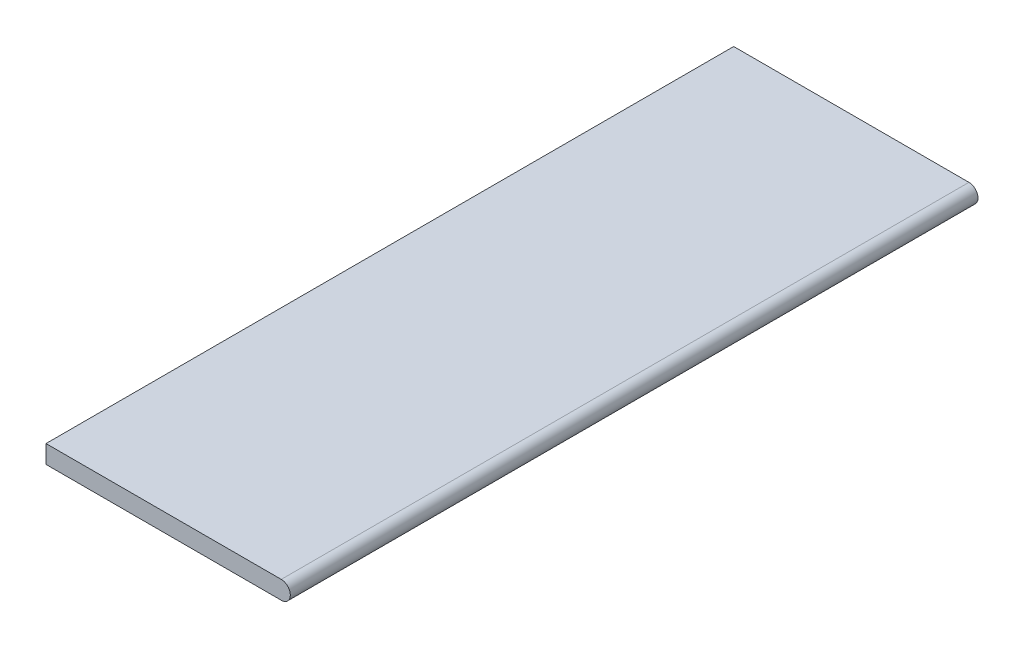
ISO-10303-21;
HEADER;
FILE_DESCRIPTION(('STEP AP214'),'2;1');
FILE_NAME('part.step','',(''),(''),'','','');
FILE_SCHEMA(('AUTOMOTIVE_DESIGN { 1 0 10303 214 1 1 1 1 }'));
ENDSEC;
DATA;
#1=APPLICATION_CONTEXT('core data for automotive mechanical design processes');
#2=APPLICATION_PROTOCOL_DEFINITION('international standard','automotive_design',2000,#1);
#3=PRODUCT_CONTEXT('',#1,'mechanical');
#4=PRODUCT('Part','Part','',(#3));
#5=PRODUCT_RELATED_PRODUCT_CATEGORY('part','',(#4));
#6=PRODUCT_DEFINITION_FORMATION('','',#4);
#7=PRODUCT_DEFINITION_CONTEXT('part definition',#1,'design');
#8=PRODUCT_DEFINITION('design','',#6,#7);
#9=PRODUCT_DEFINITION_SHAPE('','',#8);
#10=(LENGTH_UNIT() NAMED_UNIT(*) SI_UNIT(.MILLI.,.METRE.));
#11=(NAMED_UNIT(*) PLANE_ANGLE_UNIT() SI_UNIT($,.RADIAN.));
#12=(NAMED_UNIT(*) SI_UNIT($,.STERADIAN.) SOLID_ANGLE_UNIT());
#13=UNCERTAINTY_MEASURE_WITH_UNIT(LENGTH_MEASURE(1.E-05),#10,'distance_accuracy_value','');
#14=(GEOMETRIC_REPRESENTATION_CONTEXT(3) GLOBAL_UNCERTAINTY_ASSIGNED_CONTEXT((#13)) GLOBAL_UNIT_ASSIGNED_CONTEXT((#10,
#11,#12)) REPRESENTATION_CONTEXT('',''));
#15=CARTESIAN_POINT('',(0.,0.,0.));
#16=DIRECTION('',(0.,0.,1.));
#17=DIRECTION('',(1.,0.,0.));
#18=AXIS2_PLACEMENT_3D('',#15,#16,#17);
#19=CARTESIAN_POINT('',(-32.5,5.,-95.));
#20=DIRECTION('',(0.,0.,1.));
#21=DIRECTION('',(1.,0.,0.));
#22=AXIS2_PLACEMENT_3D('',#19,#20,#21);
#23=PLANE('',#22);
#24=DIRECTION('',(-1.,0.,0.));
#25=VECTOR('',#24,1.);
#26=CARTESIAN_POINT('',(-32.5,0.,-95.));
#27=LINE('',#26,#25);
#28=CARTESIAN_POINT('',(32.5,0.,-95.));
#29=VERTEX_POINT('',#28);
#30=CARTESIAN_POINT('',(-32.5,0.,-95.));
#31=VERTEX_POINT('',#30);
#32=EDGE_CURVE('E95',#29,#31,#27,.T.);
#33=ORIENTED_EDGE('',*,*,#32,.T.);
#34=DIRECTION('',(0.,-1.,0.));
#35=VECTOR('',#34,1.);
#36=CARTESIAN_POINT('',(-32.5,5.,-95.));
#37=LINE('',#36,#35);
#38=CARTESIAN_POINT('',(-32.5,5.,-95.));
#39=VERTEX_POINT('',#38);
#40=EDGE_CURVE('E11',#39,#31,#37,.T.);
#41=ORIENTED_EDGE('',*,*,#40,.F.);
#42=DIRECTION('',(-1.,0.,0.));
#43=VECTOR('',#42,1.);
#44=CARTESIAN_POINT('',(-32.5,5.,-95.));
#45=LINE('',#44,#43);
#46=CARTESIAN_POINT('',(32.5,5.,-95.));
#47=VERTEX_POINT('',#46);
#48=EDGE_CURVE('E91',#47,#39,#45,.T.);
#49=ORIENTED_EDGE('',*,*,#48,.F.);
#50=CARTESIAN_POINT('',(32.5,2.5,-95.));
#51=DIRECTION('',(0.,0.,1.));
#52=DIRECTION('',(1.,0.,0.));
#53=AXIS2_PLACEMENT_3D('',#50,#51,#52);
#54=CIRCLE('',#53,2.5);
#55=EDGE_CURVE('E105',#47,#29,#54,.F.);
#56=ORIENTED_EDGE('',*,*,#55,.T.);
#57=EDGE_LOOP('',(#33,#41,#49,#56));
#58=FACE_BOUND('',#57,.T.);
#59=ADVANCED_FACE('F45',(#58),#23,.F.);
#60=CARTESIAN_POINT('',(-32.5,5.,-95.));
#61=DIRECTION('',(1.,0.,0.));
#62=DIRECTION('',(0.,0.,-1.));
#63=AXIS2_PLACEMENT_3D('',#60,#61,#62);
#64=PLANE('',#63);
#65=DIRECTION('',(0.,0.,1.));
#66=VECTOR('',#65,1.);
#67=CARTESIAN_POINT('',(-32.5,0.,-95.));
#68=LINE('',#67,#66);
#69=CARTESIAN_POINT('',(-32.5,0.,95.));
#70=VERTEX_POINT('',#69);
#71=EDGE_CURVE('E76',#31,#70,#68,.T.);
#72=ORIENTED_EDGE('',*,*,#71,.T.);
#73=DIRECTION('',(0.,-1.,0.));
#74=VECTOR('',#73,1.);
#75=CARTESIAN_POINT('',(-32.5,5.,95.));
#76=LINE('',#75,#74);
#77=CARTESIAN_POINT('',(-32.5,5.,95.));
#78=VERTEX_POINT('',#77);
#79=EDGE_CURVE('E54',#78,#70,#76,.T.);
#80=ORIENTED_EDGE('',*,*,#79,.F.);
#81=DIRECTION('',(0.,0.,1.));
#82=VECTOR('',#81,1.);
#83=CARTESIAN_POINT('',(-32.5,5.,-95.));
#84=LINE('',#83,#82);
#85=EDGE_CURVE('E119',#39,#78,#84,.T.);
#86=ORIENTED_EDGE('',*,*,#85,.F.);
#87=ORIENTED_EDGE('',*,*,#40,.T.);
#88=EDGE_LOOP('',(#72,#80,#86,#87));
#89=FACE_BOUND('',#88,.T.);
#90=ADVANCED_FACE('F130',(#89),#64,.F.);
#91=CARTESIAN_POINT('',(-32.5,5.,95.));
#92=DIRECTION('',(0.,0.,-1.));
#93=DIRECTION('',(-1.,0.,0.));
#94=AXIS2_PLACEMENT_3D('',#91,#92,#93);
#95=PLANE('',#94);
#96=DIRECTION('',(1.,0.,0.));
#97=VECTOR('',#96,1.);
#98=CARTESIAN_POINT('',(-32.5,0.,95.));
#99=LINE('',#98,#97);
#100=CARTESIAN_POINT('',(32.5,0.,95.));
#101=VERTEX_POINT('',#100);
#102=EDGE_CURVE('E83',#70,#101,#99,.T.);
#103=ORIENTED_EDGE('',*,*,#102,.T.);
#104=CARTESIAN_POINT('',(32.5,2.5,95.));
#105=DIRECTION('',(0.,0.,1.));
#106=DIRECTION('',(1.,0.,0.));
#107=AXIS2_PLACEMENT_3D('',#104,#105,#106);
#108=CIRCLE('',#107,2.5);
#109=CARTESIAN_POINT('',(32.5,5.,95.));
#110=VERTEX_POINT('',#109);
#111=EDGE_CURVE('E106',#110,#101,#108,.F.);
#112=ORIENTED_EDGE('',*,*,#111,.F.);
#113=DIRECTION('',(1.,0.,0.));
#114=VECTOR('',#113,1.);
#115=CARTESIAN_POINT('',(-32.5,5.,95.));
#116=LINE('',#115,#114);
#117=EDGE_CURVE('E62',#78,#110,#116,.T.);
#118=ORIENTED_EDGE('',*,*,#117,.F.);
#119=ORIENTED_EDGE('',*,*,#79,.T.);
#120=EDGE_LOOP('',(#103,#112,#118,#119));
#121=FACE_BOUND('',#120,.T.);
#122=ADVANCED_FACE('F128',(#121),#95,.F.);
#123=CARTESIAN_POINT('',(0.,5.,0.));
#124=DIRECTION('',(0.,1.,0.));
#125=DIRECTION('',(0.,0.,1.));
#126=AXIS2_PLACEMENT_3D('',#123,#124,#125);
#127=PLANE('',#126);
#128=DIRECTION('',(0.,0.,-1.));
#129=VECTOR('',#128,1.);
#130=CARTESIAN_POINT('',(32.5,5.,-95.));
#131=LINE('',#130,#129);
#132=EDGE_CURVE('E114',#110,#47,#131,.T.);
#133=ORIENTED_EDGE('',*,*,#132,.T.);
#134=ORIENTED_EDGE('',*,*,#48,.T.);
#135=ORIENTED_EDGE('',*,*,#85,.T.);
#136=ORIENTED_EDGE('',*,*,#117,.T.);
#137=EDGE_LOOP('',(#133,#134,#135,#136));
#138=FACE_BOUND('',#137,.T.);
#139=ADVANCED_FACE('F131',(#138),#127,.T.);
#140=CARTESIAN_POINT('',(0.,0.,0.));
#141=DIRECTION('',(0.,1.,0.));
#142=DIRECTION('',(0.,0.,1.));
#143=AXIS2_PLACEMENT_3D('',#140,#141,#142);
#144=PLANE('',#143);
#145=DIRECTION('',(0.,0.,-1.));
#146=VECTOR('',#145,1.);
#147=CARTESIAN_POINT('',(32.5,0.,-95.));
#148=LINE('',#147,#146);
#149=EDGE_CURVE('E98',#101,#29,#148,.T.);
#150=ORIENTED_EDGE('',*,*,#149,.F.);
#151=ORIENTED_EDGE('',*,*,#102,.F.);
#152=ORIENTED_EDGE('',*,*,#71,.F.);
#153=ORIENTED_EDGE('',*,*,#32,.F.);
#154=EDGE_LOOP('',(#150,#151,#152,#153));
#155=FACE_BOUND('',#154,.T.);
#156=ADVANCED_FACE('F97',(#155),#144,.F.);
#157=CARTESIAN_POINT('',(32.5,2.5,95.));
#158=DIRECTION('',(0.,0.,-1.));
#159=DIRECTION('',(-1.,0.,0.));
#160=AXIS2_PLACEMENT_3D('',#157,#158,#159);
#161=CYLINDRICAL_SURFACE('',#160,2.5);
#162=ORIENTED_EDGE('',*,*,#149,.T.);
#163=ORIENTED_EDGE('',*,*,#55,.F.);
#164=ORIENTED_EDGE('',*,*,#132,.F.);
#165=ORIENTED_EDGE('',*,*,#111,.T.);
#166=EDGE_LOOP('',(#162,#163,#164,#165));
#167=FACE_BOUND('',#166,.T.);
#168=ADVANCED_FACE('F104',(#167),#161,.T.);
#169=CLOSED_SHELL('',(#59,#90,#122,#139,#156,#168));
#170=MANIFOLD_SOLID_BREP('B2',#169);
#171=ADVANCED_BREP_SHAPE_REPRESENTATION('',(#18,#170),#14);
#172=SHAPE_DEFINITION_REPRESENTATION(#9,#171);
ENDSEC;
END-ISO-10303-21;
